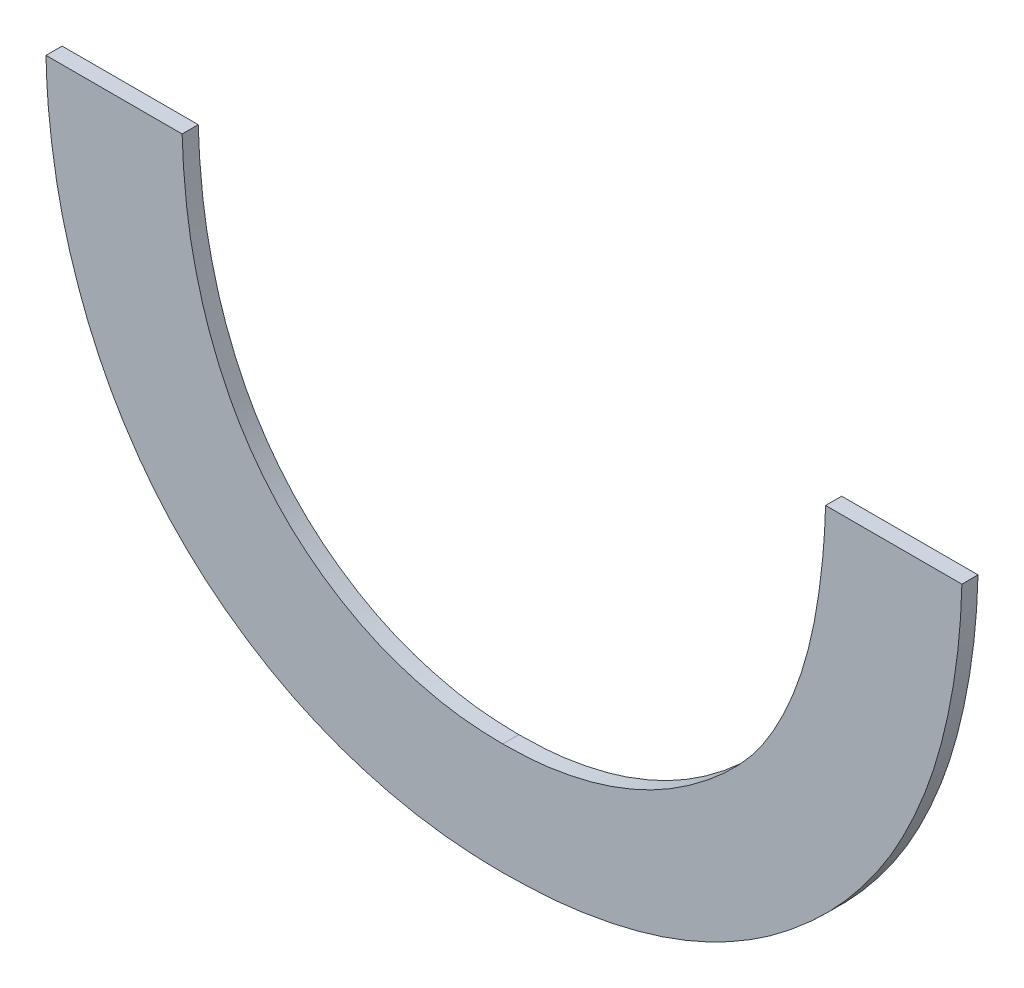
ISO-10303-21;
HEADER;
FILE_DESCRIPTION(('STEP AP214'),'2;1');
FILE_NAME('part.step','',(''),(''),'','','');
FILE_SCHEMA(('AUTOMOTIVE_DESIGN { 1 0 10303 214 1 1 1 1 }'));
ENDSEC;
DATA;
#1=APPLICATION_CONTEXT('core data for automotive mechanical design processes');
#2=APPLICATION_PROTOCOL_DEFINITION('international standard','automotive_design',2000,#1);
#3=PRODUCT_CONTEXT('',#1,'mechanical');
#4=PRODUCT('Part','Part','',(#3));
#5=PRODUCT_RELATED_PRODUCT_CATEGORY('part','',(#4));
#6=PRODUCT_DEFINITION_FORMATION('','',#4);
#7=PRODUCT_DEFINITION_CONTEXT('part definition',#1,'design');
#8=PRODUCT_DEFINITION('design','',#6,#7);
#9=PRODUCT_DEFINITION_SHAPE('','',#8);
#10=(LENGTH_UNIT() NAMED_UNIT(*) SI_UNIT(.MILLI.,.METRE.));
#11=(NAMED_UNIT(*) PLANE_ANGLE_UNIT() SI_UNIT($,.RADIAN.));
#12=(NAMED_UNIT(*) SI_UNIT($,.STERADIAN.) SOLID_ANGLE_UNIT());
#13=UNCERTAINTY_MEASURE_WITH_UNIT(LENGTH_MEASURE(1.E-05),#10,'distance_accuracy_value','');
#14=(GEOMETRIC_REPRESENTATION_CONTEXT(3) GLOBAL_UNCERTAINTY_ASSIGNED_CONTEXT((#13)) GLOBAL_UNIT_ASSIGNED_CONTEXT((#10,
#11,#12)) REPRESENTATION_CONTEXT('',''));
#15=CARTESIAN_POINT('',(0.,0.,0.));
#16=DIRECTION('',(0.,0.,1.));
#17=DIRECTION('',(1.,0.,0.));
#18=AXIS2_PLACEMENT_3D('',#15,#16,#17);
#19=CARTESIAN_POINT('',(-10.000000000001,0.0180288461538482,0.5));
#20=CARTESIAN_POINT('',(-9.99744557635471,-0.27858272342388,0.5));
#21=CARTESIAN_POINT('',(-9.99243472156512,-0.860427284018786,0.5));
#22=CARTESIAN_POINT('',(-9.92607414149345,-1.71807279979086,0.5));
#23=CARTESIAN_POINT('',(-9.84047762787904,-2.54904072161587,0.5));
#24=CARTESIAN_POINT('',(-9.71015515298632,-3.35225837539493,0.5));
#25=CARTESIAN_POINT('',(-9.53055582049023,-4.12440098802347,0.5));
#26=CARTESIAN_POINT('',(-9.33158490698864,-4.8713413718767,0.5));
#27=CARTESIAN_POINT('',(-9.08279866812223,-5.58666270492612,0.5));
#28=CARTESIAN_POINT('',(-8.80044555552239,-6.27309801767801,0.5));
#29=CARTESIAN_POINT('',(-8.48475152968106,-6.92738431576253,0.5));
#30=CARTESIAN_POINT('',(-8.1277720259527,-7.54306430041981,0.5));
#31=CARTESIAN_POINT('',(-7.73709045299985,-8.12218082558974,0.5));
#32=CARTESIAN_POINT('',(-7.30865961324641,-8.66214870803028,0.5));
#33=CARTESIAN_POINT('',(-6.85331036180753,-9.17059274233822,0.5));
#34=CARTESIAN_POINT('',(-6.35654722820983,-9.63429474967579,0.5));
#35=CARTESIAN_POINT('',(-5.82655361407255,-10.0624798956477,0.5));
#36=CARTESIAN_POINT('',(-5.2632632039855,-10.4507677551403,0.5));
#37=CARTESIAN_POINT('',(-4.67571580944574,-10.7998089001818,0.5));
#38=CARTESIAN_POINT('',(-4.06689331571299,-11.1008290401997,0.5));
#39=CARTESIAN_POINT('',(-3.43873502280452,-11.3560363989809,0.5));
#40=CARTESIAN_POINT('',(-2.79188677059659,-11.5560124527979,0.5));
#41=CARTESIAN_POINT('',(-2.13024058761423,-11.7211127821864,0.5));
#42=CARTESIAN_POINT('',(-1.45220088483219,-11.8434082483064,0.5));
#43=CARTESIAN_POINT('',(-0.752454778091716,-11.907524103166,0.5));
#44=CARTESIAN_POINT('',(-0.280563593554668,-11.9178554208152,0.5));
#45=CARTESIAN_POINT('',(-0.0420673076933394,-11.9230769230769,0.5));
#46=B_SPLINE_CURVE_WITH_KNOTS('',3,(#19,#20,#21,#22,#23,#24,#25,#26,#27,#28,#29,#30,#31,#32,#33,
#34,#35,#36,#37,#38,#39,#40,#41,#42,#43,#44,#45),.UNSPECIFIED.,.F.,.F.,(4,1,1,1,1,1,1,1,1,1,1,1,
1,1,1,1,1,1,1,1,1,1,1,1,4),(0.,0.050846677627434,0.0997427809170216,0.147423330210055,
0.194066936397945,0.23914770136266,0.283312307313427,0.3265454360452,0.368900454355592,
0.410532002333994,0.451006792287184,0.490829194283506,0.530204675028077,0.569114460564221,
0.607751906965227,0.646590369342393,0.685845811759488,0.724961246591864,0.763671910485591,
0.802197738553013,0.84108932635543,0.879661064065438,0.919078471862533,0.959101834195223,1.),.UNSPECIFIED.);
#47=DIRECTION('',(0.,0.,1.));
#48=VECTOR('',#47,1.);
#49=SURFACE_OF_LINEAR_EXTRUSION('',#46,#48);
#50=CARTESIAN_POINT('',(-9.99349190525414,-0.5,0.5));
#51=VERTEX_POINT('',#50);
#52=CARTESIAN_POINT('',(-0.0420673076933394,-11.9230769230769,0.5));
#53=VERTEX_POINT('',#52);
#54=EDGE_CURVE('E119',#51,#53,#46,.T.);
#55=ORIENTED_EDGE('',*,*,#54,.F.);
#56=DIRECTION('',(0.,0.,1.));
#57=VECTOR('',#56,1.);
#58=CARTESIAN_POINT('',(-9.99349190525414,-0.5,0.5));
#59=LINE('',#58,#57);
#60=CARTESIAN_POINT('',(-9.99349190525424,-0.499999999994658,1.));
#61=VERTEX_POINT('',#60);
#62=EDGE_CURVE('E11',#51,#61,#59,.T.);
#63=ORIENTED_EDGE('',*,*,#62,.T.);
#64=CARTESIAN_POINT('',(-10.000000000001,0.0180288461538482,1.));
#65=CARTESIAN_POINT('',(-9.99744557635471,-0.27858272342388,1.));
#66=CARTESIAN_POINT('',(-9.99243472156512,-0.860427284018786,1.));
#67=CARTESIAN_POINT('',(-9.92607414149345,-1.71807279979086,1.));
#68=CARTESIAN_POINT('',(-9.84047762787904,-2.54904072161587,1.));
#69=CARTESIAN_POINT('',(-9.71015515298632,-3.35225837539493,1.));
#70=CARTESIAN_POINT('',(-9.53055582049023,-4.12440098802347,1.));
#71=CARTESIAN_POINT('',(-9.33158490698864,-4.8713413718767,1.));
#72=CARTESIAN_POINT('',(-9.08279866812223,-5.58666270492612,1.));
#73=CARTESIAN_POINT('',(-8.80044555552239,-6.27309801767801,1.));
#74=CARTESIAN_POINT('',(-8.48475152968106,-6.92738431576253,1.));
#75=CARTESIAN_POINT('',(-8.1277720259527,-7.54306430041981,1.));
#76=CARTESIAN_POINT('',(-7.73709045299985,-8.12218082558974,1.));
#77=CARTESIAN_POINT('',(-7.30865961324641,-8.66214870803028,1.));
#78=CARTESIAN_POINT('',(-6.85331036180753,-9.17059274233822,1.));
#79=CARTESIAN_POINT('',(-6.35654722820983,-9.63429474967579,1.));
#80=CARTESIAN_POINT('',(-5.82655361407255,-10.0624798956477,1.));
#81=CARTESIAN_POINT('',(-5.2632632039855,-10.4507677551403,1.));
#82=CARTESIAN_POINT('',(-4.67571580944574,-10.7998089001818,1.));
#83=CARTESIAN_POINT('',(-4.06689331571299,-11.1008290401997,1.));
#84=CARTESIAN_POINT('',(-3.43873502280452,-11.3560363989809,1.));
#85=CARTESIAN_POINT('',(-2.79188677059659,-11.5560124527979,1.));
#86=CARTESIAN_POINT('',(-2.13024058761423,-11.7211127821864,1.));
#87=CARTESIAN_POINT('',(-1.45220088483219,-11.8434082483064,1.));
#88=CARTESIAN_POINT('',(-0.752454778091716,-11.907524103166,1.));
#89=CARTESIAN_POINT('',(-0.280563593554668,-11.9178554208152,1.));
#90=CARTESIAN_POINT('',(-0.0420673076933394,-11.9230769230769,1.));
#91=B_SPLINE_CURVE_WITH_KNOTS('',3,(#64,#65,#66,#67,#68,#69,#70,#71,#72,#73,#74,#75,#76,#77,#78,
#79,#80,#81,#82,#83,#84,#85,#86,#87,#88,#89,#90),.UNSPECIFIED.,.F.,.F.,(4,1,1,1,1,1,1,1,1,1,1,1,
1,1,1,1,1,1,1,1,1,1,1,1,4),(0.,0.050846677627434,0.0997427809170216,0.147423330210055,
0.194066936397945,0.23914770136266,0.283312307313427,0.3265454360452,0.368900454355592,
0.410532002333994,0.451006792287184,0.490829194283506,0.530204675028077,0.569114460564221,
0.607751906965227,0.646590369342393,0.685845811759488,0.724961246591864,0.763671910485591,
0.802197738553013,0.84108932635543,0.879661064065438,0.919078471862533,0.959101834195223,1.),.UNSPECIFIED.);
#92=CARTESIAN_POINT('',(-0.0420673076933394,-11.9230769230769,1.));
#93=VERTEX_POINT('',#92);
#94=EDGE_CURVE('E147',#61,#93,#91,.T.);
#95=ORIENTED_EDGE('',*,*,#94,.T.);
#96=DIRECTION('',(0.,0.,1.));
#97=VECTOR('',#96,1.);
#98=CARTESIAN_POINT('',(-0.0420673076933394,-11.9230769230769,0.5));
#99=LINE('',#98,#97);
#100=EDGE_CURVE('E111',#53,#93,#99,.T.);
#101=ORIENTED_EDGE('',*,*,#100,.F.);
#102=EDGE_LOOP('',(#55,#63,#95,#101));
#103=FACE_BOUND('',#102,.T.);
#104=ADVANCED_FACE('F39',(#103),#49,.F.);
#105=CARTESIAN_POINT('',(-0.0420673076933394,-11.9230769230769,0.5));
#106=CARTESIAN_POINT('',(0.295002830476814,-11.9162695398055,0.5));
#107=CARTESIAN_POINT('',(0.962064619344915,-11.9027977286057,0.5));
#108=CARTESIAN_POINT('',(1.94126774451052,-11.7572189585941,0.5));
#109=CARTESIAN_POINT('',(2.88636659289551,-11.538052799709,0.5));
#110=CARTESIAN_POINT('',(3.79076776224616,-11.2214783779149,0.5));
#111=CARTESIAN_POINT('',(4.66477909448501,-10.8240418486216,0.5));
#112=CARTESIAN_POINT('',(5.49834250636669,-10.3292182581973,0.5));
#113=CARTESIAN_POINT('',(6.29676283023927,-9.7473862649856,0.5));
#114=CARTESIAN_POINT('',(7.05664697467087,-9.08102161159045,0.5));
#115=CARTESIAN_POINT('',(7.76488432345179,-8.31225732390009,0.5));
#116=CARTESIAN_POINT('',(8.36396111213443,-7.4064928009553,0.5));
#117=CARTESIAN_POINT('',(8.86878492263938,-6.38469399074816,0.5));
#118=CARTESIAN_POINT('',(9.29033062398326,-5.24963881311951,0.5));
#119=CARTESIAN_POINT('',(9.61173932821176,-3.99248240395978,0.5));
#120=CARTESIAN_POINT('',(9.83387501757831,-2.61865098086246,0.5));
#121=CARTESIAN_POINT('',(9.97412638272458,-1.12669208289128,0.5));
#122=CARTESIAN_POINT('',(9.99115497432845,-0.0924806609210111,0.5));
#123=CARTESIAN_POINT('',(9.99999999999897,0.44471153846154,0.5));
#124=B_SPLINE_CURVE_WITH_KNOTS('',3,(#105,#106,#107,#108,#109,#110,#111,#112,#113,#114,#115,
#116,#117,#118,#119,#120,#121,#122,#123),.UNSPECIFIED.,.F.,.F.,(4,1,1,1,1,1,1,1,1,1,1,1,1,1,1,1,
4),(0.,0.0559436334681679,0.110712448215212,0.164054968045588,0.216875097189044,
0.269577736227049,0.323271877870319,0.377575879476796,0.433444271951342,0.490917307076603,
0.550620753620345,0.613113413715478,0.67985788442345,0.751355521248935,0.82825956597575,
0.910794234605685,1.),.UNSPECIFIED.);
#125=DIRECTION('',(0.,0.,1.));
#126=VECTOR('',#125,1.);
#127=SURFACE_OF_LINEAR_EXTRUSION('',#124,#126);
#128=CARTESIAN_POINT('',(-0.0420673076933394,-11.9230769230769,1.));
#129=CARTESIAN_POINT('',(0.295002830476814,-11.9162695398055,1.));
#130=CARTESIAN_POINT('',(0.962064619344915,-11.9027977286057,1.));
#131=CARTESIAN_POINT('',(1.94126774451052,-11.7572189585941,1.));
#132=CARTESIAN_POINT('',(2.88636659289551,-11.538052799709,1.));
#133=CARTESIAN_POINT('',(3.79076776224616,-11.2214783779149,1.));
#134=CARTESIAN_POINT('',(4.66477909448501,-10.8240418486216,1.));
#135=CARTESIAN_POINT('',(5.49834250636669,-10.3292182581973,1.));
#136=CARTESIAN_POINT('',(6.29676283023927,-9.7473862649856,1.));
#137=CARTESIAN_POINT('',(7.05664697467087,-9.08102161159045,1.));
#138=CARTESIAN_POINT('',(7.76488432345179,-8.31225732390009,1.));
#139=CARTESIAN_POINT('',(8.36396111213443,-7.4064928009553,1.));
#140=CARTESIAN_POINT('',(8.86878492263938,-6.38469399074816,1.));
#141=CARTESIAN_POINT('',(9.29033062398326,-5.24963881311951,1.));
#142=CARTESIAN_POINT('',(9.61173932821176,-3.99248240395978,1.));
#143=CARTESIAN_POINT('',(9.83387501757831,-2.61865098086246,1.));
#144=CARTESIAN_POINT('',(9.97412638272458,-1.12669208289128,1.));
#145=CARTESIAN_POINT('',(9.99115497432845,-0.0924806609210111,1.));
#146=CARTESIAN_POINT('',(9.99999999999897,0.44471153846154,1.));
#147=B_SPLINE_CURVE_WITH_KNOTS('',3,(#128,#129,#130,#131,#132,#133,#134,#135,#136,#137,#138,
#139,#140,#141,#142,#143,#144,#145,#146),.UNSPECIFIED.,.F.,.F.,(4,1,1,1,1,1,1,1,1,1,1,1,1,1,1,1,
4),(0.,0.0559436334681679,0.110712448215212,0.164054968045588,0.216875097189044,
0.269577736227049,0.323271877870319,0.377575879476796,0.433444271951342,0.490917307076603,
0.550620753620345,0.613113413715478,0.67985788442345,0.751355521248935,0.82825956597575,
0.910794234605685,1.),.UNSPECIFIED.);
#148=CARTESIAN_POINT('',(9.98009957449915,-0.5,1.));
#149=VERTEX_POINT('',#148);
#150=EDGE_CURVE('E109',#93,#149,#147,.T.);
#151=ORIENTED_EDGE('',*,*,#150,.T.);
#152=DIRECTION('',(0.,0.,1.));
#153=VECTOR('',#152,1.);
#154=CARTESIAN_POINT('',(9.98009957449915,-0.5,0.5));
#155=LINE('',#154,#153);
#156=CARTESIAN_POINT('',(9.98009957449951,-0.49999999998808,0.5));
#157=VERTEX_POINT('',#156);
#158=EDGE_CURVE('E92',#149,#157,#155,.F.);
#159=ORIENTED_EDGE('',*,*,#158,.T.);
#160=EDGE_CURVE('E148',#53,#157,#124,.T.);
#161=ORIENTED_EDGE('',*,*,#160,.F.);
#162=ORIENTED_EDGE('',*,*,#100,.T.);
#163=EDGE_LOOP('',(#151,#159,#161,#162));
#164=FACE_BOUND('',#163,.T.);
#165=ADVANCED_FACE('F174',(#164),#127,.F.);
#166=CARTESIAN_POINT('',(10.3525266492293,11.0243893653808,0.5));
#167=DIRECTION('',(0.,0.,1.));
#168=DIRECTION('',(1.,0.,0.));
#169=AXIS2_PLACEMENT_3D('',#166,#167,#168);
#170=PLANE('',#169);
#171=CARTESIAN_POINT('',(-0.0180288461548751,-15.3846153846154,0.5));
#172=CARTESIAN_POINT('',(-0.356749306755349,-15.3787544442249,0.5));
#173=CARTESIAN_POINT('',(-1.02938687797164,-15.3671156766633,0.5));
#174=CARTESIAN_POINT('',(-2.02560582632684,-15.2767900465026,0.5));
#175=CARTESIAN_POINT('',(-2.99502800585287,-15.1199595496493,0.5));
#176=CARTESIAN_POINT('',(-3.93822157634033,-14.9017832202961,0.5));
#177=CARTESIAN_POINT('',(-4.85657780349393,-14.6272947697327,0.5));
#178=CARTESIAN_POINT('',(-5.74949042709972,-14.2882851444448,0.5));
#179=CARTESIAN_POINT('',(-6.61838625400342,-13.8916961111155,0.5));
#180=CARTESIAN_POINT('',(-7.45548547927892,-13.4307630844729,0.5));
#181=CARTESIAN_POINT('',(-8.25484306567419,-12.9120942894227,0.5));
#182=CARTESIAN_POINT('',(-9.0131964014291,-12.3500657468822,0.500000000000001));
#183=CARTESIAN_POINT('',(-9.71876387071822,-11.7334048058816,0.499999999999999));
#184=CARTESIAN_POINT('',(-10.374950488324,-11.0702956402701,0.5));
#185=CARTESIAN_POINT('',(-10.9868285718024,-10.3610792334556,0.5));
#186=CARTESIAN_POINT('',(-11.5348437910391,-9.59250996055044,0.5));
#187=CARTESIAN_POINT('',(-12.0514324700553,-8.78886093046081,0.5));
#188=CARTESIAN_POINT('',(-12.5043481722338,-7.93168345010269,0.5));
#189=CARTESIAN_POINT('',(-12.9149268545526,-7.04067456233296,0.5));
#190=CARTESIAN_POINT('',(-13.2590794639402,-6.11197250085554,0.5));
#191=CARTESIAN_POINT('',(-13.5638558806522,-5.15888687865115,0.5));
#192=CARTESIAN_POINT('',(-13.8099457632569,-4.1754980706433,0.5));
#193=CARTESIAN_POINT('',(-13.9933831069537,-3.15900036672534,0.5));
#194=CARTESIAN_POINT('',(-14.1344389611334,-2.11669813494813,0.5));
#195=CARTESIAN_POINT('',(-14.2106058962525,-1.04279848506468,0.5));
#196=CARTESIAN_POINT('',(-14.2239914215737,-0.3186156677292,0.5));
#197=CARTESIAN_POINT('',(-14.2307692307703,0.048076923076925,0.5));
#198=B_SPLINE_CURVE_WITH_KNOTS('',3,(#171,#172,#173,#174,#175,#176,#177,#178,#179,#180,#181,
#182,#183,#184,#185,#186,#187,#188,#189,#190,#191,#192,#193,#194,#195,#196,#197),.UNSPECIFIED.,
.F.,.F.,(4,1,1,1,1,1,1,1,1,1,1,1,1,1,1,1,1,1,1,1,1,1,1,1,4),(0.,0.0430906778846524,
0.0855702925740404,0.127134830637577,0.167938374011362,0.20865666174595,0.248986250536247,
0.289357693379581,0.330079171452475,0.370444982624118,0.410509561229512,0.450069177648731,
0.489536737491094,0.529122616469229,0.569090613689439,0.609533590845579,0.650581554534423,
0.692323866251554,0.734264111103905,0.776500669878318,0.8195845639067,0.863124368983532,
0.907856257943642,0.953342682686761,1.),.UNSPECIFIED.);
#199=CARTESIAN_POINT('',(-0.0180288461548751,-15.3846153846154,0.5));
#200=VERTEX_POINT('',#199);
#201=CARTESIAN_POINT('',(-14.219436411881,-0.5,0.5));
#202=VERTEX_POINT('',#201);
#203=EDGE_CURVE('E122',#200,#202,#198,.T.);
#204=ORIENTED_EDGE('',*,*,#203,.T.);
#205=DIRECTION('',(1.,0.,0.));
#206=VECTOR('',#205,1.);
#207=CARTESIAN_POINT('',(10.3525266492293,-0.5,0.5));
#208=LINE('',#207,#206);
#209=EDGE_CURVE('E98',#202,#51,#208,.T.);
#210=ORIENTED_EDGE('',*,*,#209,.T.);
#211=ORIENTED_EDGE('',*,*,#54,.T.);
#212=ORIENTED_EDGE('',*,*,#160,.T.);
#213=CARTESIAN_POINT('',(14.2116048655053,-0.5,0.5));
#214=VERTEX_POINT('',#213);
#215=EDGE_CURVE('E54',#157,#214,#208,.T.);
#216=ORIENTED_EDGE('',*,*,#215,.T.);
#217=CARTESIAN_POINT('',(14.2307692307682,0.396634615384616,0.5));
#218=CARTESIAN_POINT('',(14.2202720514672,-0.204817422623856,0.5));
#219=CARTESIAN_POINT('',(14.1998188299492,-1.37671621687323,0.5));
#220=CARTESIAN_POINT('',(14.0109655451718,-3.08351997523852,0.5));
#221=CARTESIAN_POINT('',(13.6994117668546,-4.68748238642237,0.5));
#222=CARTESIAN_POINT('',(13.2708372967114,-6.19602307547613,0.5));
#223=CARTESIAN_POINT('',(12.7008191129977,-7.59776479767724,0.5));
#224=CARTESIAN_POINT('',(12.0244635886542,-8.90994439446387,0.5));
#225=CARTESIAN_POINT('',(11.2038240825213,-10.1097232095312,0.5));
#226=CARTESIAN_POINT('',(10.2765547056306,-11.210973492057,0.5));
#227=CARTESIAN_POINT('',(9.24055329986842,-12.1844701801697,0.5));
#228=CARTESIAN_POINT('',(8.13757811224587,-13.0490982561267,0.5));
#229=CARTESIAN_POINT('',(6.95377006979584,-13.7702944287552,0.5));
#230=CARTESIAN_POINT('',(5.70008919084651,-14.3657662471882,0.5));
#231=CARTESIAN_POINT('',(4.37120313422424,-14.8229518746062,0.5));
#232=CARTESIAN_POINT('',(2.97084462162314,-15.1430235147771,0.5));
#233=CARTESIAN_POINT('',(1.50051088432561,-15.3495008004343,0.5));
#234=CARTESIAN_POINT('',(0.495503380707765,-15.3727405088726,0.5));
#235=CARTESIAN_POINT('',(-0.0180288461548751,-15.3846153846154,0.5));
#236=B_SPLINE_CURVE_WITH_KNOTS('',3,(#217,#218,#219,#220,#221,#222,#223,#224,#225,#226,#227,
#228,#229,#230,#231,#232,#233,#234,#235),.UNSPECIFIED.,.F.,.F.,(4,1,1,1,1,1,1,1,1,1,1,1,1,1,1,1,
4),(0.,0.0752245959663773,0.146571310328908,0.214495259814138,0.279453407019146,
0.342418255684999,0.4035099350205,0.463774086249114,0.523875440068878,0.583261423136512,
0.641310387173778,0.698904782335547,0.756300915492992,0.814632118935108,0.874327693149184,
0.935784778362605,1.),.UNSPECIFIED.);
#237=EDGE_CURVE('E107',#214,#200,#236,.T.);
#238=ORIENTED_EDGE('',*,*,#237,.T.);
#239=EDGE_LOOP('',(#204,#210,#211,#212,#216,#238));
#240=FACE_BOUND('',#239,.T.);
#241=ADVANCED_FACE('F178',(#240),#170,.F.);
#242=DIRECTION('',(0.,0.,1.));
#243=VECTOR('',#242,1.);
#244=SURFACE_OF_LINEAR_EXTRUSION('',#198,#243);
#245=CARTESIAN_POINT('',(-0.0180288461548751,-15.3846153846154,1.));
#246=CARTESIAN_POINT('',(-0.356749306755349,-15.3787544442249,1.));
#247=CARTESIAN_POINT('',(-1.02938687797164,-15.3671156766633,1.));
#248=CARTESIAN_POINT('',(-2.02560582632684,-15.2767900465026,1.));
#249=CARTESIAN_POINT('',(-2.99502800585287,-15.1199595496493,1.));
#250=CARTESIAN_POINT('',(-3.93822157634033,-14.9017832202961,1.));
#251=CARTESIAN_POINT('',(-4.85657780349393,-14.6272947697327,1.));
#252=CARTESIAN_POINT('',(-5.74949042709972,-14.2882851444448,1.));
#253=CARTESIAN_POINT('',(-6.61838625400342,-13.8916961111155,1.));
#254=CARTESIAN_POINT('',(-7.45548547927892,-13.4307630844729,1.));
#255=CARTESIAN_POINT('',(-8.25484306567419,-12.9120942894227,1.));
#256=CARTESIAN_POINT('',(-9.0131964014291,-12.3500657468822,1.));
#257=CARTESIAN_POINT('',(-9.71876387071822,-11.7334048058816,0.999999999999999));
#258=CARTESIAN_POINT('',(-10.374950488324,-11.0702956402701,1.));
#259=CARTESIAN_POINT('',(-10.9868285718024,-10.3610792334556,1.));
#260=CARTESIAN_POINT('',(-11.5348437910391,-9.59250996055044,1.));
#261=CARTESIAN_POINT('',(-12.0514324700553,-8.78886093046081,1.));
#262=CARTESIAN_POINT('',(-12.5043481722338,-7.93168345010269,1.));
#263=CARTESIAN_POINT('',(-12.9149268545526,-7.04067456233296,1.));
#264=CARTESIAN_POINT('',(-13.2590794639402,-6.11197250085554,1.));
#265=CARTESIAN_POINT('',(-13.5638558806522,-5.15888687865115,1.));
#266=CARTESIAN_POINT('',(-13.8099457632569,-4.1754980706433,1.));
#267=CARTESIAN_POINT('',(-13.9933831069537,-3.15900036672534,1.));
#268=CARTESIAN_POINT('',(-14.1344389611334,-2.11669813494813,1.));
#269=CARTESIAN_POINT('',(-14.2106058962525,-1.04279848506468,1.));
#270=CARTESIAN_POINT('',(-14.2239914215737,-0.3186156677292,1.));
#271=CARTESIAN_POINT('',(-14.2307692307703,0.048076923076925,1.));
#272=B_SPLINE_CURVE_WITH_KNOTS('',3,(#245,#246,#247,#248,#249,#250,#251,#252,#253,#254,#255,
#256,#257,#258,#259,#260,#261,#262,#263,#264,#265,#266,#267,#268,#269,#270,#271),.UNSPECIFIED.,
.F.,.F.,(4,1,1,1,1,1,1,1,1,1,1,1,1,1,1,1,1,1,1,1,1,1,1,1,4),(0.,0.0430906778846524,
0.0855702925740404,0.127134830637577,0.167938374011362,0.20865666174595,0.248986250536247,
0.289357693379581,0.330079171452475,0.370444982624118,0.410509561229512,0.450069177648731,
0.489536737491094,0.529122616469229,0.569090613689439,0.609533590845579,0.650581554534423,
0.692323866251554,0.734264111103905,0.776500669878318,0.8195845639067,0.863124368983532,
0.907856257943642,0.953342682686761,1.),.UNSPECIFIED.);
#273=CARTESIAN_POINT('',(-0.0180288461548751,-15.3846153846154,1.));
#274=VERTEX_POINT('',#273);
#275=CARTESIAN_POINT('',(-14.219436411881,-0.5,1.));
#276=VERTEX_POINT('',#275);
#277=EDGE_CURVE('E115',#274,#276,#272,.T.);
#278=ORIENTED_EDGE('',*,*,#277,.T.);
#279=DIRECTION('',(0.,0.,1.));
#280=VECTOR('',#279,1.);
#281=CARTESIAN_POINT('',(-14.2194364118812,-0.500000000000002,0.5));
#282=LINE('',#281,#280);
#283=EDGE_CURVE('E192',#276,#202,#282,.F.);
#284=ORIENTED_EDGE('',*,*,#283,.T.);
#285=ORIENTED_EDGE('',*,*,#203,.F.);
#286=DIRECTION('',(0.,0.,1.));
#287=VECTOR('',#286,1.);
#288=CARTESIAN_POINT('',(-0.0180288461548751,-15.3846153846154,0.5));
#289=LINE('',#288,#287);
#290=EDGE_CURVE('E48',#200,#274,#289,.T.);
#291=ORIENTED_EDGE('',*,*,#290,.T.);
#292=EDGE_LOOP('',(#278,#284,#285,#291));
#293=FACE_BOUND('',#292,.T.);
#294=ADVANCED_FACE('F185',(#293),#244,.F.);
#295=DIRECTION('',(0.,0.,1.));
#296=VECTOR('',#295,1.);
#297=SURFACE_OF_LINEAR_EXTRUSION('',#236,#296);
#298=ORIENTED_EDGE('',*,*,#237,.F.);
#299=DIRECTION('',(0.,0.,1.));
#300=VECTOR('',#299,1.);
#301=CARTESIAN_POINT('',(14.2116048655094,-0.5,0.5));
#302=LINE('',#301,#300);
#303=CARTESIAN_POINT('',(14.2116048655053,-0.5,1.));
#304=VERTEX_POINT('',#303);
#305=EDGE_CURVE('E93',#214,#304,#302,.T.);
#306=ORIENTED_EDGE('',*,*,#305,.T.);
#307=CARTESIAN_POINT('',(14.2307692307682,0.396634615384616,1.));
#308=CARTESIAN_POINT('',(14.2202720514672,-0.204817422623856,1.));
#309=CARTESIAN_POINT('',(14.1998188299492,-1.37671621687323,1.));
#310=CARTESIAN_POINT('',(14.0109655451718,-3.08351997523852,1.));
#311=CARTESIAN_POINT('',(13.6994117668546,-4.68748238642237,1.));
#312=CARTESIAN_POINT('',(13.2708372967114,-6.19602307547613,1.));
#313=CARTESIAN_POINT('',(12.7008191129977,-7.59776479767724,1.));
#314=CARTESIAN_POINT('',(12.0244635886542,-8.90994439446387,1.));
#315=CARTESIAN_POINT('',(11.2038240825213,-10.1097232095312,1.));
#316=CARTESIAN_POINT('',(10.2765547056306,-11.210973492057,1.));
#317=CARTESIAN_POINT('',(9.24055329986842,-12.1844701801697,1.));
#318=CARTESIAN_POINT('',(8.13757811224587,-13.0490982561267,1.));
#319=CARTESIAN_POINT('',(6.95377006979584,-13.7702944287552,1.));
#320=CARTESIAN_POINT('',(5.70008919084651,-14.3657662471882,1.));
#321=CARTESIAN_POINT('',(4.37120313422424,-14.8229518746062,1.));
#322=CARTESIAN_POINT('',(2.97084462162314,-15.1430235147771,1.));
#323=CARTESIAN_POINT('',(1.50051088432561,-15.3495008004343,1.));
#324=CARTESIAN_POINT('',(0.495503380707765,-15.3727405088726,1.));
#325=CARTESIAN_POINT('',(-0.0180288461548751,-15.3846153846154,1.));
#326=B_SPLINE_CURVE_WITH_KNOTS('',3,(#307,#308,#309,#310,#311,#312,#313,#314,#315,#316,#317,
#318,#319,#320,#321,#322,#323,#324,#325),.UNSPECIFIED.,.F.,.F.,(4,1,1,1,1,1,1,1,1,1,1,1,1,1,1,1,
4),(0.,0.0752245959663773,0.146571310328908,0.214495259814138,0.279453407019146,
0.342418255684999,0.4035099350205,0.463774086249114,0.523875440068878,0.583261423136512,
0.641310387173778,0.698904782335547,0.756300915492992,0.814632118935108,0.874327693149184,
0.935784778362605,1.),.UNSPECIFIED.);
#327=EDGE_CURVE('E101',#304,#274,#326,.T.);
#328=ORIENTED_EDGE('',*,*,#327,.T.);
#329=ORIENTED_EDGE('',*,*,#290,.F.);
#330=EDGE_LOOP('',(#298,#306,#328,#329));
#331=FACE_BOUND('',#330,.T.);
#332=ADVANCED_FACE('F41',(#331),#297,.F.);
#333=CARTESIAN_POINT('',(10.3525266492293,11.0243893653808,1.));
#334=DIRECTION('',(0.,0.,1.));
#335=DIRECTION('',(1.,0.,0.));
#336=AXIS2_PLACEMENT_3D('',#333,#334,#335);
#337=PLANE('',#336);
#338=ORIENTED_EDGE('',*,*,#327,.F.);
#339=DIRECTION('',(-1.,0.,0.));
#340=VECTOR('',#339,1.);
#341=CARTESIAN_POINT('',(-17.,-0.5,1.));
#342=LINE('',#341,#340);
#343=EDGE_CURVE('E89',#304,#149,#342,.T.);
#344=ORIENTED_EDGE('',*,*,#343,.T.);
#345=ORIENTED_EDGE('',*,*,#150,.F.);
#346=ORIENTED_EDGE('',*,*,#94,.F.);
#347=EDGE_CURVE('E65',#61,#276,#342,.T.);
#348=ORIENTED_EDGE('',*,*,#347,.T.);
#349=ORIENTED_EDGE('',*,*,#277,.F.);
#350=EDGE_LOOP('',(#338,#344,#345,#346,#348,#349));
#351=FACE_BOUND('',#350,.T.);
#352=ADVANCED_FACE('F108',(#351),#337,.T.);
#353=CARTESIAN_POINT('',(-17.,-0.5,1.));
#354=DIRECTION('',(0.,-1.,0.));
#355=DIRECTION('',(0.,0.,-1.));
#356=AXIS2_PLACEMENT_3D('',#353,#354,#355);
#357=PLANE('',#356);
#358=ORIENTED_EDGE('',*,*,#347,.F.);
#359=ORIENTED_EDGE('',*,*,#62,.F.);
#360=ORIENTED_EDGE('',*,*,#209,.F.);
#361=ORIENTED_EDGE('',*,*,#283,.F.);
#362=EDGE_LOOP('',(#358,#359,#360,#361));
#363=FACE_BOUND('',#362,.T.);
#364=ADVANCED_FACE('F182',(#363),#357,.F.);
#365=ORIENTED_EDGE('',*,*,#215,.F.);
#366=ORIENTED_EDGE('',*,*,#158,.F.);
#367=ORIENTED_EDGE('',*,*,#343,.F.);
#368=ORIENTED_EDGE('',*,*,#305,.F.);
#369=EDGE_LOOP('',(#365,#366,#367,#368));
#370=FACE_BOUND('',#369,.T.);
#371=ADVANCED_FACE('F95',(#370),#357,.F.);
#372=CLOSED_SHELL('',(#104,#165,#241,#294,#332,#352,#364,#371));
#373=MANIFOLD_SOLID_BREP('B2',#372);
#374=ADVANCED_BREP_SHAPE_REPRESENTATION('',(#18,#373),#14);
#375=SHAPE_DEFINITION_REPRESENTATION(#9,#374);
ENDSEC;
END-ISO-10303-21;
